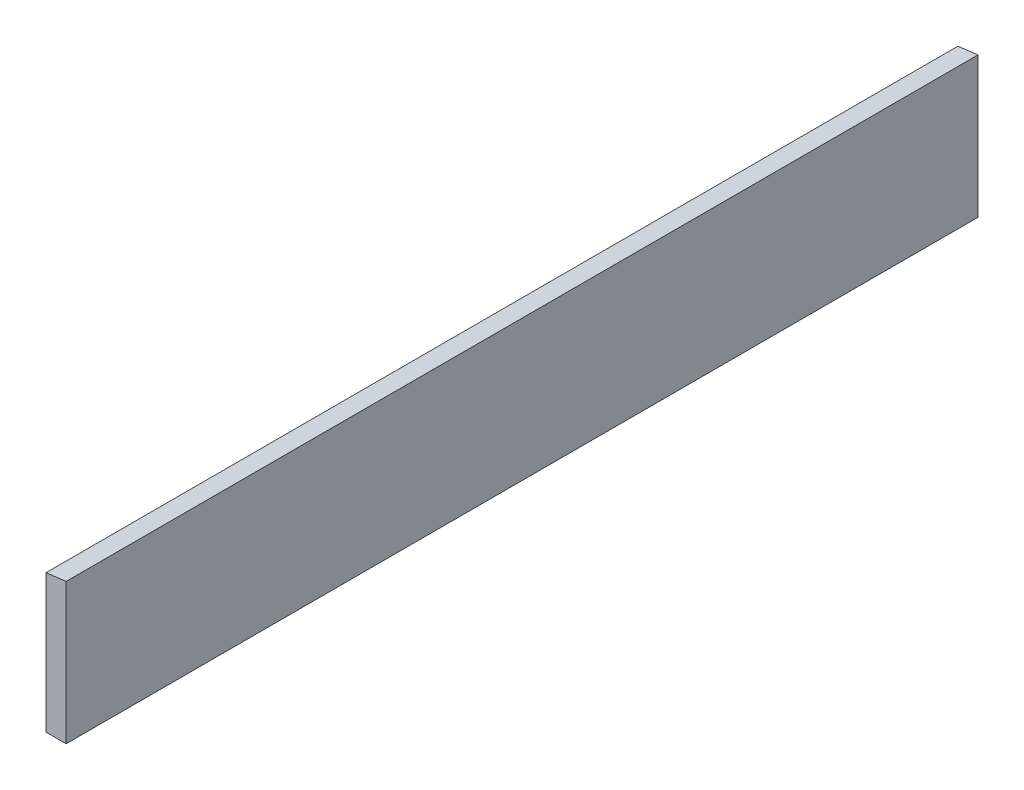
ISO-10303-21;
HEADER;
FILE_DESCRIPTION(('STEP AP214'),'2;1');
FILE_NAME('part.step','',(''),(''),'','','');
FILE_SCHEMA(('AUTOMOTIVE_DESIGN { 1 0 10303 214 1 1 1 1 }'));
ENDSEC;
DATA;
#1=APPLICATION_CONTEXT('core data for automotive mechanical design processes');
#2=APPLICATION_PROTOCOL_DEFINITION('international standard','automotive_design',2000,#1);
#3=PRODUCT_CONTEXT('',#1,'mechanical');
#4=PRODUCT('Part','Part','',(#3));
#5=PRODUCT_RELATED_PRODUCT_CATEGORY('part','',(#4));
#6=PRODUCT_DEFINITION_FORMATION('','',#4);
#7=PRODUCT_DEFINITION_CONTEXT('part definition',#1,'design');
#8=PRODUCT_DEFINITION('design','',#6,#7);
#9=PRODUCT_DEFINITION_SHAPE('','',#8);
#10=(LENGTH_UNIT() NAMED_UNIT(*) SI_UNIT(.MILLI.,.METRE.));
#11=(NAMED_UNIT(*) PLANE_ANGLE_UNIT() SI_UNIT($,.RADIAN.));
#12=(NAMED_UNIT(*) SI_UNIT($,.STERADIAN.) SOLID_ANGLE_UNIT());
#13=UNCERTAINTY_MEASURE_WITH_UNIT(LENGTH_MEASURE(1.E-05),#10,'distance_accuracy_value','');
#14=(GEOMETRIC_REPRESENTATION_CONTEXT(3) GLOBAL_UNCERTAINTY_ASSIGNED_CONTEXT((#13)) GLOBAL_UNIT_ASSIGNED_CONTEXT((#10,
#11,#12)) REPRESENTATION_CONTEXT('',''));
#15=CARTESIAN_POINT('',(0.,0.,0.));
#16=DIRECTION('',(0.,0.,1.));
#17=DIRECTION('',(1.,0.,0.));
#18=AXIS2_PLACEMENT_3D('',#15,#16,#17);
#19=CARTESIAN_POINT('',(467.736295427459,1.58782026367328E-12,863.6));
#20=DIRECTION('',(-1.,0.,0.));
#21=DIRECTION('',(0.,-1.,0.));
#22=AXIS2_PLACEMENT_3D('',#19,#20,#21);
#23=PLANE('',#22);
#24=DIRECTION('',(0.,1.,0.));
#25=VECTOR('',#24,1.);
#26=CARTESIAN_POINT('',(467.736295427459,1.58782026367328E-12,0.));
#27=LINE('',#26,#25);
#28=CARTESIAN_POINT('',(467.736295427458,27.1946714703701,0.));
#29=VERTEX_POINT('',#28);
#30=CARTESIAN_POINT('',(467.736295427458,158.013408708325,0.));
#31=VERTEX_POINT('',#30);
#32=EDGE_CURVE('E97',#29,#31,#27,.T.);
#33=ORIENTED_EDGE('',*,*,#32,.F.);
#34=DIRECTION('',(0.,0.,-1.));
#35=VECTOR('',#34,1.);
#36=CARTESIAN_POINT('',(467.736295427458,27.1946714703701,863.6));
#37=LINE('',#36,#35);
#38=CARTESIAN_POINT('',(467.736295427458,27.1946714703701,863.6));
#39=VERTEX_POINT('',#38);
#40=EDGE_CURVE('E11',#39,#29,#37,.T.);
#41=ORIENTED_EDGE('',*,*,#40,.F.);
#42=DIRECTION('',(0.,1.,0.));
#43=VECTOR('',#42,1.);
#44=CARTESIAN_POINT('',(467.736295427459,1.58782026367328E-12,863.6));
#45=LINE('',#44,#43);
#46=CARTESIAN_POINT('',(467.736295427458,158.013408708325,863.6));
#47=VERTEX_POINT('',#46);
#48=EDGE_CURVE('E85',#39,#47,#45,.T.);
#49=ORIENTED_EDGE('',*,*,#48,.T.);
#50=DIRECTION('',(0.,0.,-1.));
#51=VECTOR('',#50,1.);
#52=CARTESIAN_POINT('',(467.736295427458,158.013408708325,863.6));
#53=LINE('',#52,#51);
#54=EDGE_CURVE('E74',#47,#31,#53,.T.);
#55=ORIENTED_EDGE('',*,*,#54,.T.);
#56=EDGE_LOOP('',(#33,#41,#49,#55));
#57=FACE_BOUND('',#56,.T.);
#58=ADVANCED_FACE('F35',(#57),#23,.T.);
#59=CARTESIAN_POINT('',(0.,27.1946714703701,863.6));
#60=DIRECTION('',(0.,1.,0.));
#61=DIRECTION('',(0.,0.,1.));
#62=AXIS2_PLACEMENT_3D('',#59,#60,#61);
#63=PLANE('',#62);
#64=DIRECTION('',(1.,0.,0.));
#65=VECTOR('',#64,1.);
#66=CARTESIAN_POINT('',(0.,27.1946714703701,0.));
#67=LINE('',#66,#65);
#68=CARTESIAN_POINT('',(486.786295427458,27.1946714703701,0.));
#69=VERTEX_POINT('',#68);
#70=EDGE_CURVE('E90',#29,#69,#67,.T.);
#71=ORIENTED_EDGE('',*,*,#70,.T.);
#72=DIRECTION('',(0.,0.,-1.));
#73=VECTOR('',#72,1.);
#74=CARTESIAN_POINT('',(486.786295427458,27.1946714703701,863.6));
#75=LINE('',#74,#73);
#76=CARTESIAN_POINT('',(486.786295427458,27.1946714703701,863.6));
#77=VERTEX_POINT('',#76);
#78=EDGE_CURVE('E43',#77,#69,#75,.T.);
#79=ORIENTED_EDGE('',*,*,#78,.F.);
#80=DIRECTION('',(1.,0.,0.));
#81=VECTOR('',#80,1.);
#82=CARTESIAN_POINT('',(0.,27.1946714703701,863.6));
#83=LINE('',#82,#81);
#84=EDGE_CURVE('E80',#39,#77,#83,.T.);
#85=ORIENTED_EDGE('',*,*,#84,.F.);
#86=ORIENTED_EDGE('',*,*,#40,.T.);
#87=EDGE_LOOP('',(#71,#79,#85,#86));
#88=FACE_BOUND('',#87,.T.);
#89=ADVANCED_FACE('F88',(#88),#63,.F.);
#90=CARTESIAN_POINT('',(486.786295427458,3.54620310535137E-13,863.6));
#91=DIRECTION('',(-1.,0.,0.));
#92=DIRECTION('',(0.,-1.,0.));
#93=AXIS2_PLACEMENT_3D('',#90,#91,#92);
#94=PLANE('',#93);
#95=DIRECTION('',(0.,1.,0.));
#96=VECTOR('',#95,1.);
#97=CARTESIAN_POINT('',(486.786295427458,3.54620310535137E-13,0.));
#98=LINE('',#97,#96);
#99=CARTESIAN_POINT('',(486.786295427458,160.396225773722,0.));
#100=VERTEX_POINT('',#99);
#101=EDGE_CURVE('E67',#69,#100,#98,.T.);
#102=ORIENTED_EDGE('',*,*,#101,.T.);
#103=DIRECTION('',(0.,0.,-1.));
#104=VECTOR('',#103,1.);
#105=CARTESIAN_POINT('',(486.786295427458,160.396225773722,863.6));
#106=LINE('',#105,#104);
#107=CARTESIAN_POINT('',(486.786295427458,160.396225773722,863.6));
#108=VERTEX_POINT('',#107);
#109=EDGE_CURVE('E91',#108,#100,#106,.T.);
#110=ORIENTED_EDGE('',*,*,#109,.F.);
#111=DIRECTION('',(0.,1.,0.));
#112=VECTOR('',#111,1.);
#113=CARTESIAN_POINT('',(486.786295427458,3.54620310535137E-13,863.6));
#114=LINE('',#113,#112);
#115=EDGE_CURVE('E84',#77,#108,#114,.T.);
#116=ORIENTED_EDGE('',*,*,#115,.F.);
#117=ORIENTED_EDGE('',*,*,#78,.T.);
#118=EDGE_LOOP('',(#102,#110,#116,#117));
#119=FACE_BOUND('',#118,.T.);
#120=ADVANCED_FACE('F92',(#119),#94,.F.);
#121=CARTESIAN_POINT('',(-12.2549370215559,97.9750202610744,863.6));
#122=DIRECTION('',(0.12411510301651,-0.992267827354692,0.));
#123=DIRECTION('',(0.992267827354692,0.12411510301651,0.));
#124=AXIS2_PLACEMENT_3D('',#121,#122,#123);
#125=PLANE('',#124);
#126=DIRECTION('',(-0.992267827354692,-0.12411510301651,0.));
#127=VECTOR('',#126,1.);
#128=CARTESIAN_POINT('',(-12.2549370215559,97.9750202610744,0.));
#129=LINE('',#128,#127);
#130=EDGE_CURVE('E102',#100,#31,#129,.T.);
#131=ORIENTED_EDGE('',*,*,#130,.T.);
#132=ORIENTED_EDGE('',*,*,#54,.F.);
#133=DIRECTION('',(-0.992267827354692,-0.12411510301651,0.));
#134=VECTOR('',#133,1.);
#135=CARTESIAN_POINT('',(-12.2549370215559,97.9750202610744,863.6));
#136=LINE('',#135,#134);
#137=EDGE_CURVE('E51',#108,#47,#136,.T.);
#138=ORIENTED_EDGE('',*,*,#137,.F.);
#139=ORIENTED_EDGE('',*,*,#109,.T.);
#140=EDGE_LOOP('',(#131,#132,#138,#139));
#141=FACE_BOUND('',#140,.T.);
#142=ADVANCED_FACE('F107',(#141),#125,.F.);
#143=CARTESIAN_POINT('',(0.,0.,863.6));
#144=DIRECTION('',(0.,0.,1.));
#145=DIRECTION('',(1.,0.,0.));
#146=AXIS2_PLACEMENT_3D('',#143,#144,#145);
#147=PLANE('',#146);
#148=ORIENTED_EDGE('',*,*,#48,.F.);
#149=ORIENTED_EDGE('',*,*,#84,.T.);
#150=ORIENTED_EDGE('',*,*,#115,.T.);
#151=ORIENTED_EDGE('',*,*,#137,.T.);
#152=EDGE_LOOP('',(#148,#149,#150,#151));
#153=FACE_BOUND('',#152,.T.);
#154=ADVANCED_FACE('F82',(#153),#147,.T.);
#155=CARTESIAN_POINT('',(0.,0.,0.));
#156=DIRECTION('',(0.,0.,1.));
#157=DIRECTION('',(1.,0.,0.));
#158=AXIS2_PLACEMENT_3D('',#155,#156,#157);
#159=PLANE('',#158);
#160=ORIENTED_EDGE('',*,*,#32,.T.);
#161=ORIENTED_EDGE('',*,*,#130,.F.);
#162=ORIENTED_EDGE('',*,*,#101,.F.);
#163=ORIENTED_EDGE('',*,*,#70,.F.);
#164=EDGE_LOOP('',(#160,#161,#162,#163));
#165=FACE_BOUND('',#164,.T.);
#166=ADVANCED_FACE('F109',(#165),#159,.F.);
#167=CLOSED_SHELL('',(#58,#89,#120,#142,#154,#166));
#168=MANIFOLD_SOLID_BREP('B2',#167);
#169=ADVANCED_BREP_SHAPE_REPRESENTATION('',(#18,#168),#14);
#170=SHAPE_DEFINITION_REPRESENTATION(#9,#169);
ENDSEC;
END-ISO-10303-21;
